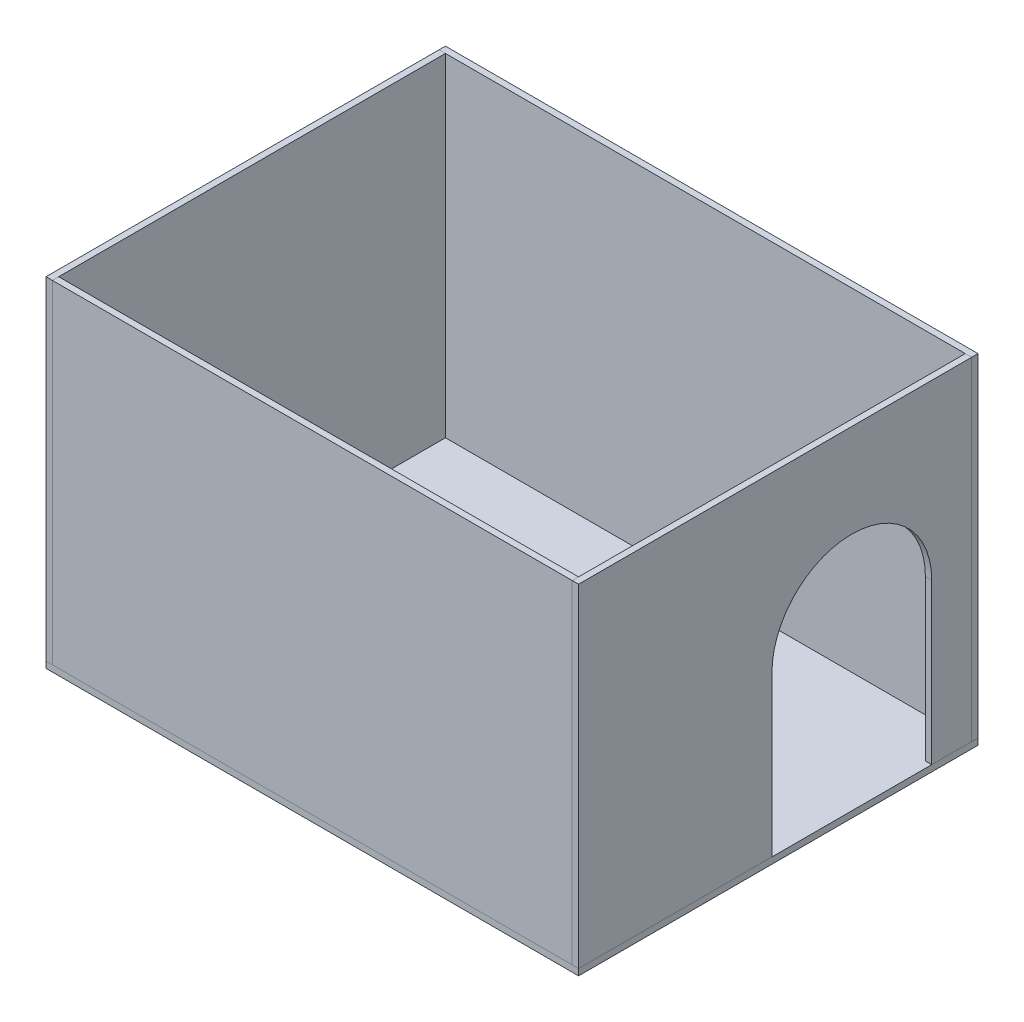
ISO-10303-21;
HEADER;
FILE_DESCRIPTION(('STEP AP214'),'2;1');
FILE_NAME('part.step','',(''),(''),'','','');
FILE_SCHEMA(('AUTOMOTIVE_DESIGN { 1 0 10303 214 1 1 1 1 }'));
ENDSEC;
DATA;
#1=APPLICATION_CONTEXT('core data for automotive mechanical design processes');
#2=APPLICATION_PROTOCOL_DEFINITION('international standard','automotive_design',2000,#1);
#3=PRODUCT_CONTEXT('',#1,'mechanical');
#4=PRODUCT('Part','Part','',(#3));
#5=PRODUCT_RELATED_PRODUCT_CATEGORY('part','',(#4));
#6=PRODUCT_DEFINITION_FORMATION('','',#4);
#7=PRODUCT_DEFINITION_CONTEXT('part definition',#1,'design');
#8=PRODUCT_DEFINITION('design','',#6,#7);
#9=PRODUCT_DEFINITION_SHAPE('','',#8);
#10=(LENGTH_UNIT() NAMED_UNIT(*) SI_UNIT(.MILLI.,.METRE.));
#11=(NAMED_UNIT(*) PLANE_ANGLE_UNIT() SI_UNIT($,.RADIAN.));
#12=(NAMED_UNIT(*) SI_UNIT($,.STERADIAN.) SOLID_ANGLE_UNIT());
#13=UNCERTAINTY_MEASURE_WITH_UNIT(LENGTH_MEASURE(1.E-05),#10,'distance_accuracy_value','');
#14=(GEOMETRIC_REPRESENTATION_CONTEXT(3) GLOBAL_UNCERTAINTY_ASSIGNED_CONTEXT((#13)) GLOBAL_UNIT_ASSIGNED_CONTEXT((#10,
#11,#12)) REPRESENTATION_CONTEXT('',''));
#15=CARTESIAN_POINT('',(0.,0.,0.));
#16=DIRECTION('',(0.,0.,1.));
#17=DIRECTION('',(1.,0.,0.));
#18=AXIS2_PLACEMENT_3D('',#15,#16,#17);
#19=CARTESIAN_POINT('',(0.,254.76,0.));
#20=DIRECTION('',(0.,0.,-1.));
#21=DIRECTION('',(-1.,0.,0.));
#22=AXIS2_PLACEMENT_3D('',#19,#20,#21);
#23=PLANE('',#22);
#24=DIRECTION('',(1.,0.,0.));
#25=VECTOR('',#24,1.);
#26=CARTESIAN_POINT('',(0.,4.76,0.));
#27=LINE('',#26,#25);
#28=CARTESIAN_POINT('',(4.76000000000004,4.76,0.));
#29=VERTEX_POINT('',#28);
#30=CARTESIAN_POINT('',(395.24,4.76,0.));
#31=VERTEX_POINT('',#30);
#32=EDGE_CURVE('E108',#29,#31,#27,.T.);
#33=ORIENTED_EDGE('',*,*,#32,.T.);
#34=DIRECTION('',(0.,-1.,0.));
#35=VECTOR('',#34,1.);
#36=CARTESIAN_POINT('',(395.24,254.76,0.));
#37=LINE('',#36,#35);
#38=CARTESIAN_POINT('',(395.24,254.76,0.));
#39=VERTEX_POINT('',#38);
#40=EDGE_CURVE('E12',#39,#31,#37,.T.);
#41=ORIENTED_EDGE('',*,*,#40,.F.);
#42=DIRECTION('',(1.,0.,0.));
#43=VECTOR('',#42,1.);
#44=CARTESIAN_POINT('',(0.,254.76,0.));
#45=LINE('',#44,#43);
#46=CARTESIAN_POINT('',(4.76000000000004,254.76,0.));
#47=VERTEX_POINT('',#46);
#48=EDGE_CURVE('E85',#47,#39,#45,.T.);
#49=ORIENTED_EDGE('',*,*,#48,.F.);
#50=DIRECTION('',(0.,-1.,0.));
#51=VECTOR('',#50,1.);
#52=CARTESIAN_POINT('',(4.76000000000004,254.76,0.));
#53=LINE('',#52,#51);
#54=EDGE_CURVE('E61',#47,#29,#53,.T.);
#55=ORIENTED_EDGE('',*,*,#54,.T.);
#56=EDGE_LOOP('',(#33,#41,#49,#55));
#57=FACE_BOUND('',#56,.T.);
#58=ADVANCED_FACE('F45',(#57),#23,.F.);
#59=CARTESIAN_POINT('',(395.24,254.76,0.));
#60=DIRECTION('',(1.,0.,0.));
#61=DIRECTION('',(0.,0.,-1.));
#62=AXIS2_PLACEMENT_3D('',#59,#60,#61);
#63=PLANE('',#62);
#64=DIRECTION('',(0.,0.,1.));
#65=VECTOR('',#64,1.);
#66=CARTESIAN_POINT('',(395.24,4.76,0.));
#67=LINE('',#66,#65);
#68=CARTESIAN_POINT('',(395.24,4.76,-4.76));
#69=VERTEX_POINT('',#68);
#70=EDGE_CURVE('E94',#69,#31,#67,.T.);
#71=ORIENTED_EDGE('',*,*,#70,.F.);
#72=DIRECTION('',(0.,-1.,0.));
#73=VECTOR('',#72,1.);
#74=CARTESIAN_POINT('',(395.24,254.76,-4.76));
#75=LINE('',#74,#73);
#76=CARTESIAN_POINT('',(395.24,254.76,-4.76));
#77=VERTEX_POINT('',#76);
#78=EDGE_CURVE('E53',#77,#69,#75,.T.);
#79=ORIENTED_EDGE('',*,*,#78,.F.);
#80=DIRECTION('',(0.,0.,1.));
#81=VECTOR('',#80,1.);
#82=CARTESIAN_POINT('',(395.24,254.76,0.));
#83=LINE('',#82,#81);
#84=EDGE_CURVE('E92',#77,#39,#83,.T.);
#85=ORIENTED_EDGE('',*,*,#84,.T.);
#86=ORIENTED_EDGE('',*,*,#40,.T.);
#87=EDGE_LOOP('',(#71,#79,#85,#86));
#88=FACE_BOUND('',#87,.T.);
#89=ADVANCED_FACE('F91',(#88),#63,.T.);
#90=CARTESIAN_POINT('',(0.,254.76,-4.76));
#91=DIRECTION('',(0.,0.,-1.));
#92=DIRECTION('',(-1.,0.,0.));
#93=AXIS2_PLACEMENT_3D('',#90,#91,#92);
#94=PLANE('',#93);
#95=DIRECTION('',(1.,0.,0.));
#96=VECTOR('',#95,1.);
#97=CARTESIAN_POINT('',(0.,4.76,-4.76));
#98=LINE('',#97,#96);
#99=CARTESIAN_POINT('',(4.76000000000004,4.76,-4.76));
#100=VERTEX_POINT('',#99);
#101=EDGE_CURVE('E111',#100,#69,#98,.T.);
#102=ORIENTED_EDGE('',*,*,#101,.F.);
#103=DIRECTION('',(0.,-1.,0.));
#104=VECTOR('',#103,1.);
#105=CARTESIAN_POINT('',(4.76000000000004,254.76,-4.76));
#106=LINE('',#105,#104);
#107=CARTESIAN_POINT('',(4.76000000000004,254.76,-4.76));
#108=VERTEX_POINT('',#107);
#109=EDGE_CURVE('E74',#108,#100,#106,.T.);
#110=ORIENTED_EDGE('',*,*,#109,.F.);
#111=DIRECTION('',(1.,0.,0.));
#112=VECTOR('',#111,1.);
#113=CARTESIAN_POINT('',(0.,254.76,-4.76));
#114=LINE('',#113,#112);
#115=EDGE_CURVE('E100',#108,#77,#114,.T.);
#116=ORIENTED_EDGE('',*,*,#115,.T.);
#117=ORIENTED_EDGE('',*,*,#78,.T.);
#118=EDGE_LOOP('',(#102,#110,#116,#117));
#119=FACE_BOUND('',#118,.T.);
#120=ADVANCED_FACE('F102',(#119),#94,.T.);
#121=CARTESIAN_POINT('',(4.76000000000004,254.76,0.));
#122=DIRECTION('',(-1.,0.,0.));
#123=DIRECTION('',(0.,0.,1.));
#124=AXIS2_PLACEMENT_3D('',#121,#122,#123);
#125=PLANE('',#124);
#126=DIRECTION('',(0.,0.,-1.));
#127=VECTOR('',#126,1.);
#128=CARTESIAN_POINT('',(4.76000000000004,4.76,0.));
#129=LINE('',#128,#127);
#130=EDGE_CURVE('E113',#29,#100,#129,.T.);
#131=ORIENTED_EDGE('',*,*,#130,.F.);
#132=ORIENTED_EDGE('',*,*,#54,.F.);
#133=DIRECTION('',(0.,0.,-1.));
#134=VECTOR('',#133,1.);
#135=CARTESIAN_POINT('',(4.76000000000004,254.76,0.));
#136=LINE('',#135,#134);
#137=EDGE_CURVE('E103',#47,#108,#136,.T.);
#138=ORIENTED_EDGE('',*,*,#137,.T.);
#139=ORIENTED_EDGE('',*,*,#109,.T.);
#140=EDGE_LOOP('',(#131,#132,#138,#139));
#141=FACE_BOUND('',#140,.T.);
#142=ADVANCED_FACE('F119',(#141),#125,.T.);
#143=CARTESIAN_POINT('',(0.,254.76,0.));
#144=DIRECTION('',(0.,-1.,0.));
#145=DIRECTION('',(0.,0.,-1.));
#146=AXIS2_PLACEMENT_3D('',#143,#144,#145);
#147=PLANE('',#146);
#148=ORIENTED_EDGE('',*,*,#48,.T.);
#149=ORIENTED_EDGE('',*,*,#84,.F.);
#150=ORIENTED_EDGE('',*,*,#115,.F.);
#151=ORIENTED_EDGE('',*,*,#137,.F.);
#152=EDGE_LOOP('',(#148,#149,#150,#151));
#153=FACE_BOUND('',#152,.T.);
#154=ADVANCED_FACE('F99',(#153),#147,.F.);
#155=CARTESIAN_POINT('',(0.,4.76,0.));
#156=DIRECTION('',(0.,-1.,0.));
#157=DIRECTION('',(0.,0.,-1.));
#158=AXIS2_PLACEMENT_3D('',#155,#156,#157);
#159=PLANE('',#158);
#160=ORIENTED_EDGE('',*,*,#32,.F.);
#161=ORIENTED_EDGE('',*,*,#130,.T.);
#162=ORIENTED_EDGE('',*,*,#101,.T.);
#163=ORIENTED_EDGE('',*,*,#70,.T.);
#164=EDGE_LOOP('',(#160,#161,#162,#163));
#165=FACE_BOUND('',#164,.T.);
#166=ADVANCED_FACE('F118',(#165),#159,.T.);
#167=CLOSED_SHELL('',(#58,#89,#120,#142,#154,#166));
#168=MANIFOLD_SOLID_BREP('B2',#167);
#169=CARTESIAN_POINT('',(0.,4.76,0.));
#170=DIRECTION('',(0.,1.,0.));
#171=DIRECTION('',(0.,0.,1.));
#172=AXIS2_PLACEMENT_3D('',#169,#170,#171);
#173=PLANE('',#172);
#174=DIRECTION('',(0.,0.,-1.));
#175=VECTOR('',#174,1.);
#176=CARTESIAN_POINT('',(395.24,4.76,0.));
#177=LINE('',#176,#175);
#178=CARTESIAN_POINT('',(395.24,4.76,0.));
#179=VERTEX_POINT('',#178);
#180=CARTESIAN_POINT('',(395.24,4.76,-145.24));
#181=VERTEX_POINT('',#180);
#182=EDGE_CURVE('E277',#179,#181,#177,.T.);
#183=ORIENTED_EDGE('',*,*,#182,.T.);
#184=DIRECTION('',(1.,0.,0.));
#185=VECTOR('',#184,1.);
#186=CARTESIAN_POINT('',(0.,4.76,-145.24));
#187=LINE('',#186,#185);
#188=CARTESIAN_POINT('',(400.,4.76,-145.24));
#189=VERTEX_POINT('',#188);
#190=EDGE_CURVE('E43',#181,#189,#187,.T.);
#191=ORIENTED_EDGE('',*,*,#190,.T.);
#192=DIRECTION('',(0.,0.,-1.));
#193=VECTOR('',#192,1.);
#194=CARTESIAN_POINT('',(400.,4.76,0.));
#195=LINE('',#194,#193);
#196=CARTESIAN_POINT('',(400.,4.76,0.));
#197=VERTEX_POINT('',#196);
#198=EDGE_CURVE('E269',#197,#189,#195,.T.);
#199=ORIENTED_EDGE('',*,*,#198,.F.);
#200=DIRECTION('',(1.,0.,0.));
#201=VECTOR('',#200,1.);
#202=CARTESIAN_POINT('',(0.,4.76,0.));
#203=LINE('',#202,#201);
#204=EDGE_CURVE('E271',#179,#197,#203,.T.);
#205=ORIENTED_EDGE('',*,*,#204,.F.);
#206=EDGE_LOOP('',(#183,#191,#199,#205));
#207=FACE_BOUND('',#206,.T.);
#208=ADVANCED_FACE('F179',(#207),#173,.F.);
#209=CARTESIAN_POINT('',(0.,254.76,-295.24));
#210=DIRECTION('',(0.,0.,-1.));
#211=DIRECTION('',(-1.,0.,0.));
#212=AXIS2_PLACEMENT_3D('',#209,#210,#211);
#213=PLANE('',#212);
#214=DIRECTION('',(1.,0.,0.));
#215=VECTOR('',#214,1.);
#216=CARTESIAN_POINT('',(0.,4.76,-295.24));
#217=LINE('',#216,#215);
#218=CARTESIAN_POINT('',(395.24,4.76,-295.24));
#219=VERTEX_POINT('',#218);
#220=CARTESIAN_POINT('',(400.,4.76,-295.24));
#221=VERTEX_POINT('',#220);
#222=EDGE_CURVE('E268',#219,#221,#217,.T.);
#223=ORIENTED_EDGE('',*,*,#222,.F.);
#224=DIRECTION('',(0.,-1.,0.));
#225=VECTOR('',#224,1.);
#226=CARTESIAN_POINT('',(395.24,254.76,-295.24));
#227=LINE('',#226,#225);
#228=CARTESIAN_POINT('',(395.24,254.76,-295.24));
#229=VERTEX_POINT('',#228);
#230=EDGE_CURVE('E203',#229,#219,#227,.T.);
#231=ORIENTED_EDGE('',*,*,#230,.F.);
#232=DIRECTION('',(1.,0.,0.));
#233=VECTOR('',#232,1.);
#234=CARTESIAN_POINT('',(0.,254.76,-295.24));
#235=LINE('',#234,#233);
#236=CARTESIAN_POINT('',(400.,254.76,-295.24));
#237=VERTEX_POINT('',#236);
#238=EDGE_CURVE('E280',#229,#237,#235,.T.);
#239=ORIENTED_EDGE('',*,*,#238,.T.);
#240=DIRECTION('',(0.,-1.,0.));
#241=VECTOR('',#240,1.);
#242=CARTESIAN_POINT('',(400.,254.76,-295.24));
#243=LINE('',#242,#241);
#244=EDGE_CURVE('E287',#237,#221,#243,.T.);
#245=ORIENTED_EDGE('',*,*,#244,.T.);
#246=EDGE_LOOP('',(#223,#231,#239,#245));
#247=FACE_BOUND('',#246,.T.);
#248=ADVANCED_FACE('F181',(#247),#213,.T.);
#249=CARTESIAN_POINT('',(395.24,254.76,0.));
#250=DIRECTION('',(-1.,0.,0.));
#251=DIRECTION('',(0.,0.,1.));
#252=AXIS2_PLACEMENT_3D('',#249,#250,#251);
#253=PLANE('',#252);
#254=DIRECTION('',(0.,1.,0.));
#255=VECTOR('',#254,1.);
#256=CARTESIAN_POINT('',(395.24,254.76,-145.24));
#257=LINE('',#256,#255);
#258=CARTESIAN_POINT('',(395.24,124.76,-145.24));
#259=VERTEX_POINT('',#258);
#260=EDGE_CURVE('E298',#181,#259,#257,.T.);
#261=ORIENTED_EDGE('',*,*,#260,.F.);
#262=ORIENTED_EDGE('',*,*,#182,.F.);
#263=DIRECTION('',(0.,-1.,0.));
#264=VECTOR('',#263,1.);
#265=CARTESIAN_POINT('',(395.24,254.76,0.));
#266=LINE('',#265,#264);
#267=CARTESIAN_POINT('',(395.24,254.76,0.));
#268=VERTEX_POINT('',#267);
#269=EDGE_CURVE('E282',#268,#179,#266,.T.);
#270=ORIENTED_EDGE('',*,*,#269,.F.);
#271=DIRECTION('',(0.,0.,-1.));
#272=VECTOR('',#271,1.);
#273=CARTESIAN_POINT('',(395.24,254.76,0.));
#274=LINE('',#273,#272);
#275=EDGE_CURVE('E288',#268,#229,#274,.T.);
#276=ORIENTED_EDGE('',*,*,#275,.T.);
#277=ORIENTED_EDGE('',*,*,#230,.T.);
#278=CARTESIAN_POINT('',(395.24,4.76,-265.24));
#279=VERTEX_POINT('',#278);
#280=EDGE_CURVE('E225',#279,#219,#177,.T.);
#281=ORIENTED_EDGE('',*,*,#280,.F.);
#282=DIRECTION('',(0.,-1.,0.));
#283=VECTOR('',#282,1.);
#284=CARTESIAN_POINT('',(395.24,254.76,-265.24));
#285=LINE('',#284,#283);
#286=CARTESIAN_POINT('',(395.24,124.76,-265.24));
#287=VERTEX_POINT('',#286);
#288=EDGE_CURVE('E194',#287,#279,#285,.T.);
#289=ORIENTED_EDGE('',*,*,#288,.F.);
#290=CARTESIAN_POINT('',(395.24,124.76,-205.24));
#291=DIRECTION('',(-1.,0.,0.));
#292=DIRECTION('',(0.,0.,1.));
#293=AXIS2_PLACEMENT_3D('',#290,#291,#292);
#294=CIRCLE('',#293,60.);
#295=EDGE_CURVE('E272',#259,#287,#294,.T.);
#296=ORIENTED_EDGE('',*,*,#295,.F.);
#297=EDGE_LOOP('',(#261,#262,#270,#276,#277,#281,#289,#296));
#298=FACE_BOUND('',#297,.T.);
#299=ADVANCED_FACE('F318',(#298),#253,.T.);
#300=CARTESIAN_POINT('',(0.,254.76,0.));
#301=DIRECTION('',(0.,0.,-1.));
#302=DIRECTION('',(-1.,0.,0.));
#303=AXIS2_PLACEMENT_3D('',#300,#301,#302);
#304=PLANE('',#303);
#305=ORIENTED_EDGE('',*,*,#204,.T.);
#306=DIRECTION('',(0.,-1.,0.));
#307=VECTOR('',#306,1.);
#308=CARTESIAN_POINT('',(400.,254.76,0.));
#309=LINE('',#308,#307);
#310=CARTESIAN_POINT('',(400.,254.76,0.));
#311=VERTEX_POINT('',#310);
#312=EDGE_CURVE('E284',#311,#197,#309,.T.);
#313=ORIENTED_EDGE('',*,*,#312,.F.);
#314=DIRECTION('',(1.,0.,0.));
#315=VECTOR('',#314,1.);
#316=CARTESIAN_POINT('',(0.,254.76,0.));
#317=LINE('',#316,#315);
#318=EDGE_CURVE('E290',#268,#311,#317,.T.);
#319=ORIENTED_EDGE('',*,*,#318,.F.);
#320=ORIENTED_EDGE('',*,*,#269,.T.);
#321=EDGE_LOOP('',(#305,#313,#319,#320));
#322=FACE_BOUND('',#321,.T.);
#323=ADVANCED_FACE('F325',(#322),#304,.F.);
#324=CARTESIAN_POINT('',(400.,254.76,0.));
#325=DIRECTION('',(-1.,0.,0.));
#326=DIRECTION('',(0.,0.,1.));
#327=AXIS2_PLACEMENT_3D('',#324,#325,#326);
#328=PLANE('',#327);
#329=ORIENTED_EDGE('',*,*,#198,.T.);
#330=DIRECTION('',(0.,-1.,0.));
#331=VECTOR('',#330,1.);
#332=CARTESIAN_POINT('',(400.,4.76,-145.24));
#333=LINE('',#332,#331);
#334=CARTESIAN_POINT('',(400.,124.76,-145.24));
#335=VERTEX_POINT('',#334);
#336=EDGE_CURVE('E304',#335,#189,#333,.T.);
#337=ORIENTED_EDGE('',*,*,#336,.F.);
#338=CARTESIAN_POINT('',(400.,124.76,-205.24));
#339=DIRECTION('',(1.,0.,0.));
#340=DIRECTION('',(0.,0.,1.));
#341=AXIS2_PLACEMENT_3D('',#338,#339,#340);
#342=CIRCLE('',#341,60.);
#343=CARTESIAN_POINT('',(400.,124.76,-265.24));
#344=VERTEX_POINT('',#343);
#345=EDGE_CURVE('E265',#344,#335,#342,.T.);
#346=ORIENTED_EDGE('',*,*,#345,.F.);
#347=DIRECTION('',(0.,1.,0.));
#348=VECTOR('',#347,1.);
#349=CARTESIAN_POINT('',(400.,124.76,-265.24));
#350=LINE('',#349,#348);
#351=CARTESIAN_POINT('',(400.,4.76,-265.24));
#352=VERTEX_POINT('',#351);
#353=EDGE_CURVE('E255',#352,#344,#350,.T.);
#354=ORIENTED_EDGE('',*,*,#353,.F.);
#355=EDGE_CURVE('E261',#352,#221,#195,.T.);
#356=ORIENTED_EDGE('',*,*,#355,.T.);
#357=ORIENTED_EDGE('',*,*,#244,.F.);
#358=DIRECTION('',(0.,0.,-1.));
#359=VECTOR('',#358,1.);
#360=CARTESIAN_POINT('',(400.,254.76,0.));
#361=LINE('',#360,#359);
#362=EDGE_CURVE('E231',#311,#237,#361,.T.);
#363=ORIENTED_EDGE('',*,*,#362,.F.);
#364=ORIENTED_EDGE('',*,*,#312,.T.);
#365=EDGE_LOOP('',(#329,#337,#346,#354,#356,#357,#363,#364));
#366=FACE_BOUND('',#365,.T.);
#367=ADVANCED_FACE('F260',(#366),#328,.F.);
#368=CARTESIAN_POINT('',(0.,254.76,0.));
#369=DIRECTION('',(0.,1.,0.));
#370=DIRECTION('',(0.,0.,1.));
#371=AXIS2_PLACEMENT_3D('',#368,#369,#370);
#372=PLANE('',#371);
#373=ORIENTED_EDGE('',*,*,#238,.F.);
#374=ORIENTED_EDGE('',*,*,#275,.F.);
#375=ORIENTED_EDGE('',*,*,#318,.T.);
#376=ORIENTED_EDGE('',*,*,#362,.T.);
#377=EDGE_LOOP('',(#373,#374,#375,#376));
#378=FACE_BOUND('',#377,.T.);
#379=ADVANCED_FACE('F334',(#378),#372,.T.);
#380=ORIENTED_EDGE('',*,*,#355,.F.);
#381=DIRECTION('',(-1.,0.,0.));
#382=VECTOR('',#381,1.);
#383=CARTESIAN_POINT('',(0.,4.76,-265.24));
#384=LINE('',#383,#382);
#385=EDGE_CURVE('E187',#352,#279,#384,.T.);
#386=ORIENTED_EDGE('',*,*,#385,.T.);
#387=ORIENTED_EDGE('',*,*,#280,.T.);
#388=ORIENTED_EDGE('',*,*,#222,.T.);
#389=EDGE_LOOP('',(#380,#386,#387,#388));
#390=FACE_BOUND('',#389,.T.);
#391=ADVANCED_FACE('F267',(#390),#173,.F.);
#392=CARTESIAN_POINT('',(395.,4.76,-145.24));
#393=DIRECTION('',(0.,0.,1.));
#394=DIRECTION('',(0.,-1.,0.));
#395=AXIS2_PLACEMENT_3D('',#392,#393,#394);
#396=PLANE('',#395);
#397=ORIENTED_EDGE('',*,*,#260,.T.);
#398=DIRECTION('',(1.,0.,0.));
#399=VECTOR('',#398,1.);
#400=CARTESIAN_POINT('',(395.,124.76,-145.24));
#401=LINE('',#400,#399);
#402=EDGE_CURVE('E301',#259,#335,#401,.T.);
#403=ORIENTED_EDGE('',*,*,#402,.T.);
#404=ORIENTED_EDGE('',*,*,#336,.T.);
#405=ORIENTED_EDGE('',*,*,#190,.F.);
#406=EDGE_LOOP('',(#397,#403,#404,#405));
#407=FACE_BOUND('',#406,.T.);
#408=ADVANCED_FACE('F313',(#407),#396,.F.);
#409=CARTESIAN_POINT('',(395.,124.76,-205.24));
#410=DIRECTION('',(1.,0.,0.));
#411=DIRECTION('',(0.,0.,-1.));
#412=AXIS2_PLACEMENT_3D('',#409,#410,#411);
#413=CYLINDRICAL_SURFACE('',#412,60.);
#414=ORIENTED_EDGE('',*,*,#295,.T.);
#415=DIRECTION('',(1.,0.,0.));
#416=VECTOR('',#415,1.);
#417=CARTESIAN_POINT('',(395.,124.76,-265.24));
#418=LINE('',#417,#416);
#419=EDGE_CURVE('E302',#287,#344,#418,.T.);
#420=ORIENTED_EDGE('',*,*,#419,.T.);
#421=ORIENTED_EDGE('',*,*,#345,.T.);
#422=ORIENTED_EDGE('',*,*,#402,.F.);
#423=EDGE_LOOP('',(#414,#420,#421,#422));
#424=FACE_BOUND('',#423,.T.);
#425=ADVANCED_FACE('F309',(#424),#413,.F.);
#426=CARTESIAN_POINT('',(395.,124.76,-265.24));
#427=DIRECTION('',(0.,0.,-1.));
#428=DIRECTION('',(-1.,0.,0.));
#429=AXIS2_PLACEMENT_3D('',#426,#427,#428);
#430=PLANE('',#429);
#431=ORIENTED_EDGE('',*,*,#288,.T.);
#432=ORIENTED_EDGE('',*,*,#385,.F.);
#433=ORIENTED_EDGE('',*,*,#353,.T.);
#434=ORIENTED_EDGE('',*,*,#419,.F.);
#435=EDGE_LOOP('',(#431,#432,#433,#434));
#436=FACE_BOUND('',#435,.T.);
#437=ADVANCED_FACE('F254',(#436),#430,.F.);
#438=CLOSED_SHELL('',(#208,#248,#299,#323,#367,#379,#391,#408,#425,#437));
#439=MANIFOLD_SOLID_BREP('B6',#438);
#440=CARTESIAN_POINT('',(2.29595754173402E-12,254.76,0.));
#441=DIRECTION('',(1.,0.,0.));
#442=DIRECTION('',(0.,0.,-1.));
#443=AXIS2_PLACEMENT_3D('',#440,#441,#442);
#444=PLANE('',#443);
#445=DIRECTION('',(0.,0.,1.));
#446=VECTOR('',#445,1.);
#447=CARTESIAN_POINT('',(2.29595754173402E-12,4.76,0.));
#448=LINE('',#447,#446);
#449=CARTESIAN_POINT('',(0.,4.76,-300.));
#450=VERTEX_POINT('',#449);
#451=CARTESIAN_POINT('',(0.,4.76,-295.24));
#452=VERTEX_POINT('',#451);
#453=EDGE_CURVE('E476',#450,#452,#448,.T.);
#454=ORIENTED_EDGE('',*,*,#453,.T.);
#455=DIRECTION('',(0.,-1.,0.));
#456=VECTOR('',#455,1.);
#457=CARTESIAN_POINT('',(0.,254.76,-295.24));
#458=LINE('',#457,#456);
#459=CARTESIAN_POINT('',(0.,254.76,-295.24));
#460=VERTEX_POINT('',#459);
#461=EDGE_CURVE('E177',#460,#452,#458,.T.);
#462=ORIENTED_EDGE('',*,*,#461,.F.);
#463=DIRECTION('',(0.,0.,1.));
#464=VECTOR('',#463,1.);
#465=CARTESIAN_POINT('',(2.29595754173402E-12,254.76,0.));
#466=LINE('',#465,#464);
#467=CARTESIAN_POINT('',(0.,254.76,-300.));
#468=VERTEX_POINT('',#467);
#469=EDGE_CURVE('E462',#468,#460,#466,.T.);
#470=ORIENTED_EDGE('',*,*,#469,.F.);
#471=DIRECTION('',(0.,-1.,0.));
#472=VECTOR('',#471,1.);
#473=CARTESIAN_POINT('',(0.,254.76,-300.));
#474=LINE('',#473,#472);
#475=EDGE_CURVE('E429',#468,#450,#474,.T.);
#476=ORIENTED_EDGE('',*,*,#475,.T.);
#477=EDGE_LOOP('',(#454,#462,#470,#476));
#478=FACE_BOUND('',#477,.T.);
#479=ADVANCED_FACE('F413',(#478),#444,.F.);
#480=CARTESIAN_POINT('',(0.,254.76,-295.24));
#481=DIRECTION('',(0.,0.,-1.));
#482=DIRECTION('',(-1.,0.,0.));
#483=AXIS2_PLACEMENT_3D('',#480,#481,#482);
#484=PLANE('',#483);
#485=DIRECTION('',(1.,0.,0.));
#486=VECTOR('',#485,1.);
#487=CARTESIAN_POINT('',(0.,4.76,-295.24));
#488=LINE('',#487,#486);
#489=CARTESIAN_POINT('',(400.,4.76,-295.24));
#490=VERTEX_POINT('',#489);
#491=EDGE_CURVE('E467',#452,#490,#488,.T.);
#492=ORIENTED_EDGE('',*,*,#491,.T.);
#493=DIRECTION('',(0.,-1.,0.));
#494=VECTOR('',#493,1.);
#495=CARTESIAN_POINT('',(400.,254.76,-295.24));
#496=LINE('',#495,#494);
#497=CARTESIAN_POINT('',(400.,254.76,-295.24));
#498=VERTEX_POINT('',#497);
#499=EDGE_CURVE('E421',#498,#490,#496,.T.);
#500=ORIENTED_EDGE('',*,*,#499,.F.);
#501=DIRECTION('',(1.,0.,0.));
#502=VECTOR('',#501,1.);
#503=CARTESIAN_POINT('',(0.,254.76,-295.24));
#504=LINE('',#503,#502);
#505=EDGE_CURVE('E454',#460,#498,#504,.T.);
#506=ORIENTED_EDGE('',*,*,#505,.F.);
#507=ORIENTED_EDGE('',*,*,#461,.T.);
#508=EDGE_LOOP('',(#492,#500,#506,#507));
#509=FACE_BOUND('',#508,.T.);
#510=ADVANCED_FACE('F466',(#509),#484,.F.);
#511=CARTESIAN_POINT('',(400.,254.76,0.));
#512=DIRECTION('',(1.,0.,0.));
#513=DIRECTION('',(0.,0.,-1.));
#514=AXIS2_PLACEMENT_3D('',#511,#512,#513);
#515=PLANE('',#514);
#516=DIRECTION('',(0.,0.,1.));
#517=VECTOR('',#516,1.);
#518=CARTESIAN_POINT('',(400.,4.76,0.));
#519=LINE('',#518,#517);
#520=CARTESIAN_POINT('',(400.,4.76,-300.));
#521=VERTEX_POINT('',#520);
#522=EDGE_CURVE('E479',#521,#490,#519,.T.);
#523=ORIENTED_EDGE('',*,*,#522,.F.);
#524=DIRECTION('',(0.,-1.,0.));
#525=VECTOR('',#524,1.);
#526=CARTESIAN_POINT('',(400.,254.76,-300.));
#527=LINE('',#526,#525);
#528=CARTESIAN_POINT('',(400.,254.76,-300.));
#529=VERTEX_POINT('',#528);
#530=EDGE_CURVE('E443',#529,#521,#527,.T.);
#531=ORIENTED_EDGE('',*,*,#530,.F.);
#532=DIRECTION('',(0.,0.,1.));
#533=VECTOR('',#532,1.);
#534=CARTESIAN_POINT('',(400.,254.76,0.));
#535=LINE('',#534,#533);
#536=EDGE_CURVE('E461',#529,#498,#535,.T.);
#537=ORIENTED_EDGE('',*,*,#536,.T.);
#538=ORIENTED_EDGE('',*,*,#499,.T.);
#539=EDGE_LOOP('',(#523,#531,#537,#538));
#540=FACE_BOUND('',#539,.T.);
#541=ADVANCED_FACE('F470',(#540),#515,.T.);
#542=CARTESIAN_POINT('',(0.,254.76,-300.));
#543=DIRECTION('',(0.,0.,-1.));
#544=DIRECTION('',(-1.,0.,0.));
#545=AXIS2_PLACEMENT_3D('',#542,#543,#544);
#546=PLANE('',#545);
#547=DIRECTION('',(1.,0.,0.));
#548=VECTOR('',#547,1.);
#549=CARTESIAN_POINT('',(0.,4.76,-300.));
#550=LINE('',#549,#548);
#551=EDGE_CURVE('E481',#450,#521,#550,.T.);
#552=ORIENTED_EDGE('',*,*,#551,.F.);
#553=ORIENTED_EDGE('',*,*,#475,.F.);
#554=DIRECTION('',(1.,0.,0.));
#555=VECTOR('',#554,1.);
#556=CARTESIAN_POINT('',(0.,254.76,-300.));
#557=LINE('',#556,#555);
#558=EDGE_CURVE('E471',#468,#529,#557,.T.);
#559=ORIENTED_EDGE('',*,*,#558,.T.);
#560=ORIENTED_EDGE('',*,*,#530,.T.);
#561=EDGE_LOOP('',(#552,#553,#559,#560));
#562=FACE_BOUND('',#561,.T.);
#563=ADVANCED_FACE('F487',(#562),#546,.T.);
#564=CARTESIAN_POINT('',(0.,254.76,0.));
#565=DIRECTION('',(0.,1.,0.));
#566=DIRECTION('',(0.,0.,1.));
#567=AXIS2_PLACEMENT_3D('',#564,#565,#566);
#568=PLANE('',#567);
#569=ORIENTED_EDGE('',*,*,#469,.T.);
#570=ORIENTED_EDGE('',*,*,#505,.T.);
#571=ORIENTED_EDGE('',*,*,#536,.F.);
#572=ORIENTED_EDGE('',*,*,#558,.F.);
#573=EDGE_LOOP('',(#569,#570,#571,#572));
#574=FACE_BOUND('',#573,.T.);
#575=ADVANCED_FACE('F458',(#574),#568,.T.);
#576=CARTESIAN_POINT('',(0.,4.76,0.));
#577=DIRECTION('',(0.,1.,0.));
#578=DIRECTION('',(0.,0.,1.));
#579=AXIS2_PLACEMENT_3D('',#576,#577,#578);
#580=PLANE('',#579);
#581=ORIENTED_EDGE('',*,*,#453,.F.);
#582=ORIENTED_EDGE('',*,*,#551,.T.);
#583=ORIENTED_EDGE('',*,*,#522,.T.);
#584=ORIENTED_EDGE('',*,*,#491,.F.);
#585=EDGE_LOOP('',(#581,#582,#583,#584));
#586=FACE_BOUND('',#585,.T.);
#587=ADVANCED_FACE('F486',(#586),#580,.F.);
#588=CLOSED_SHELL('',(#479,#510,#541,#563,#575,#587));
#589=MANIFOLD_SOLID_BREP('B37',#588);
#590=CARTESIAN_POINT('',(4.76000000000004,254.76,0.));
#591=DIRECTION('',(-1.,0.,0.));
#592=DIRECTION('',(0.,0.,1.));
#593=AXIS2_PLACEMENT_3D('',#590,#591,#592);
#594=PLANE('',#593);
#595=DIRECTION('',(0.,0.,-1.));
#596=VECTOR('',#595,1.);
#597=CARTESIAN_POINT('',(4.76000000000004,4.76,0.));
#598=LINE('',#597,#596);
#599=CARTESIAN_POINT('',(4.76000000000004,4.76,0.));
#600=VERTEX_POINT('',#599);
#601=CARTESIAN_POINT('',(4.76000000000004,4.76,-295.24));
#602=VERTEX_POINT('',#601);
#603=EDGE_CURVE('E608',#600,#602,#598,.T.);
#604=ORIENTED_EDGE('',*,*,#603,.T.);
#605=DIRECTION('',(0.,-1.,0.));
#606=VECTOR('',#605,1.);
#607=CARTESIAN_POINT('',(4.76000000000004,254.76,-295.24));
#608=LINE('',#607,#606);
#609=CARTESIAN_POINT('',(4.76000000000004,254.76,-295.24));
#610=VERTEX_POINT('',#609);
#611=EDGE_CURVE('E411',#610,#602,#608,.T.);
#612=ORIENTED_EDGE('',*,*,#611,.F.);
#613=DIRECTION('',(0.,0.,-1.));
#614=VECTOR('',#613,1.);
#615=CARTESIAN_POINT('',(4.76000000000004,254.76,0.));
#616=LINE('',#615,#614);
#617=CARTESIAN_POINT('',(4.76000000000004,254.76,0.));
#618=VERTEX_POINT('',#617);
#619=EDGE_CURVE('E585',#618,#610,#616,.T.);
#620=ORIENTED_EDGE('',*,*,#619,.F.);
#621=DIRECTION('',(0.,-1.,0.));
#622=VECTOR('',#621,1.);
#623=CARTESIAN_POINT('',(4.76000000000004,254.76,0.));
#624=LINE('',#623,#622);
#625=EDGE_CURVE('E561',#618,#600,#624,.T.);
#626=ORIENTED_EDGE('',*,*,#625,.T.);
#627=EDGE_LOOP('',(#604,#612,#620,#626));
#628=FACE_BOUND('',#627,.T.);
#629=ADVANCED_FACE('F545',(#628),#594,.F.);
#630=CARTESIAN_POINT('',(0.,254.76,-295.24));
#631=DIRECTION('',(0.,0.,-1.));
#632=DIRECTION('',(-1.,0.,0.));
#633=AXIS2_PLACEMENT_3D('',#630,#631,#632);
#634=PLANE('',#633);
#635=DIRECTION('',(1.,0.,0.));
#636=VECTOR('',#635,1.);
#637=CARTESIAN_POINT('',(0.,4.76,-295.24));
#638=LINE('',#637,#636);
#639=CARTESIAN_POINT('',(0.,4.76,-295.24));
#640=VERTEX_POINT('',#639);
#641=EDGE_CURVE('E594',#640,#602,#638,.T.);
#642=ORIENTED_EDGE('',*,*,#641,.F.);
#643=DIRECTION('',(0.,-1.,0.));
#644=VECTOR('',#643,1.);
#645=CARTESIAN_POINT('',(0.,254.76,-295.24));
#646=LINE('',#645,#644);
#647=CARTESIAN_POINT('',(0.,254.76,-295.24));
#648=VERTEX_POINT('',#647);
#649=EDGE_CURVE('E553',#648,#640,#646,.T.);
#650=ORIENTED_EDGE('',*,*,#649,.F.);
#651=DIRECTION('',(1.,0.,0.));
#652=VECTOR('',#651,1.);
#653=CARTESIAN_POINT('',(0.,254.76,-295.24));
#654=LINE('',#653,#652);
#655=EDGE_CURVE('E592',#648,#610,#654,.T.);
#656=ORIENTED_EDGE('',*,*,#655,.T.);
#657=ORIENTED_EDGE('',*,*,#611,.T.);
#658=EDGE_LOOP('',(#642,#650,#656,#657));
#659=FACE_BOUND('',#658,.T.);
#660=ADVANCED_FACE('F591',(#659),#634,.T.);
#661=CARTESIAN_POINT('',(0.,254.76,0.));
#662=DIRECTION('',(-1.,0.,0.));
#663=DIRECTION('',(0.,0.,1.));
#664=AXIS2_PLACEMENT_3D('',#661,#662,#663);
#665=PLANE('',#664);
#666=DIRECTION('',(0.,0.,-1.));
#667=VECTOR('',#666,1.);
#668=CARTESIAN_POINT('',(0.,4.76,0.));
#669=LINE('',#668,#667);
#670=CARTESIAN_POINT('',(0.,4.76,0.));
#671=VERTEX_POINT('',#670);
#672=EDGE_CURVE('E611',#671,#640,#669,.T.);
#673=ORIENTED_EDGE('',*,*,#672,.F.);
#674=DIRECTION('',(0.,-1.,0.));
#675=VECTOR('',#674,1.);
#676=CARTESIAN_POINT('',(0.,254.76,0.));
#677=LINE('',#676,#675);
#678=CARTESIAN_POINT('',(0.,254.76,0.));
#679=VERTEX_POINT('',#678);
#680=EDGE_CURVE('E574',#679,#671,#677,.T.);
#681=ORIENTED_EDGE('',*,*,#680,.F.);
#682=DIRECTION('',(0.,0.,-1.));
#683=VECTOR('',#682,1.);
#684=CARTESIAN_POINT('',(0.,254.76,0.));
#685=LINE('',#684,#683);
#686=EDGE_CURVE('E600',#679,#648,#685,.T.);
#687=ORIENTED_EDGE('',*,*,#686,.T.);
#688=ORIENTED_EDGE('',*,*,#649,.T.);
#689=EDGE_LOOP('',(#673,#681,#687,#688));
#690=FACE_BOUND('',#689,.T.);
#691=ADVANCED_FACE('F602',(#690),#665,.T.);
#692=CARTESIAN_POINT('',(0.,254.76,0.));
#693=DIRECTION('',(0.,0.,1.));
#694=DIRECTION('',(1.,0.,0.));
#695=AXIS2_PLACEMENT_3D('',#692,#693,#694);
#696=PLANE('',#695);
#697=DIRECTION('',(-1.,0.,0.));
#698=VECTOR('',#697,1.);
#699=CARTESIAN_POINT('',(0.,4.76,0.));
#700=LINE('',#699,#698);
#701=EDGE_CURVE('E613',#600,#671,#700,.T.);
#702=ORIENTED_EDGE('',*,*,#701,.F.);
#703=ORIENTED_EDGE('',*,*,#625,.F.);
#704=DIRECTION('',(-1.,0.,0.));
#705=VECTOR('',#704,1.);
#706=CARTESIAN_POINT('',(0.,254.76,0.));
#707=LINE('',#706,#705);
#708=EDGE_CURVE('E603',#618,#679,#707,.T.);
#709=ORIENTED_EDGE('',*,*,#708,.T.);
#710=ORIENTED_EDGE('',*,*,#680,.T.);
#711=EDGE_LOOP('',(#702,#703,#709,#710));
#712=FACE_BOUND('',#711,.T.);
#713=ADVANCED_FACE('F619',(#712),#696,.T.);
#714=CARTESIAN_POINT('',(0.,254.76,0.));
#715=DIRECTION('',(0.,-1.,0.));
#716=DIRECTION('',(0.,0.,-1.));
#717=AXIS2_PLACEMENT_3D('',#714,#715,#716);
#718=PLANE('',#717);
#719=ORIENTED_EDGE('',*,*,#619,.T.);
#720=ORIENTED_EDGE('',*,*,#655,.F.);
#721=ORIENTED_EDGE('',*,*,#686,.F.);
#722=ORIENTED_EDGE('',*,*,#708,.F.);
#723=EDGE_LOOP('',(#719,#720,#721,#722));
#724=FACE_BOUND('',#723,.T.);
#725=ADVANCED_FACE('F599',(#724),#718,.F.);
#726=CARTESIAN_POINT('',(0.,4.76,0.));
#727=DIRECTION('',(0.,-1.,0.));
#728=DIRECTION('',(0.,0.,-1.));
#729=AXIS2_PLACEMENT_3D('',#726,#727,#728);
#730=PLANE('',#729);
#731=ORIENTED_EDGE('',*,*,#603,.F.);
#732=ORIENTED_EDGE('',*,*,#701,.T.);
#733=ORIENTED_EDGE('',*,*,#672,.T.);
#734=ORIENTED_EDGE('',*,*,#641,.T.);
#735=EDGE_LOOP('',(#731,#732,#733,#734));
#736=FACE_BOUND('',#735,.T.);
#737=ADVANCED_FACE('F618',(#736),#730,.T.);
#738=CLOSED_SHELL('',(#629,#660,#691,#713,#725,#737));
#739=MANIFOLD_SOLID_BREP('B171',#738);
#740=CARTESIAN_POINT('',(0.,4.76,0.));
#741=DIRECTION('',(1.,0.,0.));
#742=DIRECTION('',(0.,0.,-1.));
#743=AXIS2_PLACEMENT_3D('',#740,#741,#742);
#744=PLANE('',#743);
#745=DIRECTION('',(0.,0.,1.));
#746=VECTOR('',#745,1.);
#747=CARTESIAN_POINT('',(0.,0.,0.));
#748=LINE('',#747,#746);
#749=CARTESIAN_POINT('',(0.,0.,-300.));
#750=VERTEX_POINT('',#749);
#751=CARTESIAN_POINT('',(0.,0.,0.));
#752=VERTEX_POINT('',#751);
#753=EDGE_CURVE('E733',#750,#752,#748,.T.);
#754=ORIENTED_EDGE('',*,*,#753,.T.);
#755=DIRECTION('',(0.,-1.,0.));
#756=VECTOR('',#755,1.);
#757=CARTESIAN_POINT('',(0.,4.76,0.));
#758=LINE('',#757,#756);
#759=CARTESIAN_POINT('',(0.,4.76,0.));
#760=VERTEX_POINT('',#759);
#761=EDGE_CURVE('E543',#760,#752,#758,.T.);
#762=ORIENTED_EDGE('',*,*,#761,.F.);
#763=DIRECTION('',(0.,0.,1.));
#764=VECTOR('',#763,1.);
#765=CARTESIAN_POINT('',(0.,4.76,0.));
#766=LINE('',#765,#764);
#767=CARTESIAN_POINT('',(0.,4.76,-300.));
#768=VERTEX_POINT('',#767);
#769=EDGE_CURVE('E720',#768,#760,#766,.T.);
#770=ORIENTED_EDGE('',*,*,#769,.F.);
#771=DIRECTION('',(0.,-1.,0.));
#772=VECTOR('',#771,1.);
#773=CARTESIAN_POINT('',(0.,4.76,-300.));
#774=LINE('',#773,#772);
#775=EDGE_CURVE('E728',#768,#750,#774,.T.);
#776=ORIENTED_EDGE('',*,*,#775,.T.);
#777=EDGE_LOOP('',(#754,#762,#770,#776));
#778=FACE_BOUND('',#777,.T.);
#779=ADVANCED_FACE('F668',(#778),#744,.F.);
#780=CARTESIAN_POINT('',(0.,4.76,0.));
#781=DIRECTION('',(0.,0.,-1.));
#782=DIRECTION('',(-1.,0.,0.));
#783=AXIS2_PLACEMENT_3D('',#780,#781,#782);
#784=PLANE('',#783);
#785=DIRECTION('',(1.,0.,0.));
#786=VECTOR('',#785,1.);
#787=CARTESIAN_POINT('',(0.,0.,0.));
#788=LINE('',#787,#786);
#789=CARTESIAN_POINT('',(400.,0.,0.));
#790=VERTEX_POINT('',#789);
#791=EDGE_CURVE('E724',#752,#790,#788,.T.);
#792=ORIENTED_EDGE('',*,*,#791,.T.);
#793=DIRECTION('',(0.,-1.,0.));
#794=VECTOR('',#793,1.);
#795=CARTESIAN_POINT('',(400.,4.76,0.));
#796=LINE('',#795,#794);
#797=CARTESIAN_POINT('',(400.,4.76,0.));
#798=VERTEX_POINT('',#797);
#799=EDGE_CURVE('E678',#798,#790,#796,.T.);
#800=ORIENTED_EDGE('',*,*,#799,.F.);
#801=DIRECTION('',(1.,0.,0.));
#802=VECTOR('',#801,1.);
#803=CARTESIAN_POINT('',(0.,4.76,0.));
#804=LINE('',#803,#802);
#805=EDGE_CURVE('E716',#760,#798,#804,.T.);
#806=ORIENTED_EDGE('',*,*,#805,.F.);
#807=ORIENTED_EDGE('',*,*,#761,.T.);
#808=EDGE_LOOP('',(#792,#800,#806,#807));
#809=FACE_BOUND('',#808,.T.);
#810=ADVANCED_FACE('F723',(#809),#784,.F.);
#811=CARTESIAN_POINT('',(400.,4.76,0.));
#812=DIRECTION('',(-1.,0.,0.));
#813=DIRECTION('',(0.,0.,1.));
#814=AXIS2_PLACEMENT_3D('',#811,#812,#813);
#815=PLANE('',#814);
#816=DIRECTION('',(0.,0.,-1.));
#817=VECTOR('',#816,1.);
#818=CARTESIAN_POINT('',(400.,0.,0.));
#819=LINE('',#818,#817);
#820=CARTESIAN_POINT('',(400.,0.,-300.));
#821=VERTEX_POINT('',#820);
#822=EDGE_CURVE('E703',#790,#821,#819,.T.);
#823=ORIENTED_EDGE('',*,*,#822,.T.);
#824=DIRECTION('',(0.,-1.,0.));
#825=VECTOR('',#824,1.);
#826=CARTESIAN_POINT('',(400.,4.76,-300.));
#827=LINE('',#826,#825);
#828=CARTESIAN_POINT('',(400.,4.76,-300.));
#829=VERTEX_POINT('',#828);
#830=EDGE_CURVE('E725',#829,#821,#827,.T.);
#831=ORIENTED_EDGE('',*,*,#830,.F.);
#832=DIRECTION('',(0.,0.,-1.));
#833=VECTOR('',#832,1.);
#834=CARTESIAN_POINT('',(400.,4.76,0.));
#835=LINE('',#834,#833);
#836=EDGE_CURVE('E671',#798,#829,#835,.T.);
#837=ORIENTED_EDGE('',*,*,#836,.F.);
#838=ORIENTED_EDGE('',*,*,#799,.T.);
#839=EDGE_LOOP('',(#823,#831,#837,#838));
#840=FACE_BOUND('',#839,.T.);
#841=ADVANCED_FACE('F727',(#840),#815,.F.);
#842=CARTESIAN_POINT('',(0.,4.76,-300.));
#843=DIRECTION('',(0.,0.,1.));
#844=DIRECTION('',(1.,0.,0.));
#845=AXIS2_PLACEMENT_3D('',#842,#843,#844);
#846=PLANE('',#845);
#847=DIRECTION('',(-1.,0.,0.));
#848=VECTOR('',#847,1.);
#849=CARTESIAN_POINT('',(0.,0.,-300.));
#850=LINE('',#849,#848);
#851=EDGE_CURVE('E709',#821,#750,#850,.T.);
#852=ORIENTED_EDGE('',*,*,#851,.T.);
#853=ORIENTED_EDGE('',*,*,#775,.F.);
#854=DIRECTION('',(-1.,0.,0.));
#855=VECTOR('',#854,1.);
#856=CARTESIAN_POINT('',(0.,4.76,-300.));
#857=LINE('',#856,#855);
#858=EDGE_CURVE('E686',#829,#768,#857,.T.);
#859=ORIENTED_EDGE('',*,*,#858,.F.);
#860=ORIENTED_EDGE('',*,*,#830,.T.);
#861=EDGE_LOOP('',(#852,#853,#859,#860));
#862=FACE_BOUND('',#861,.T.);
#863=ADVANCED_FACE('F739',(#862),#846,.F.);
#864=CARTESIAN_POINT('',(0.,4.76,0.));
#865=DIRECTION('',(0.,-1.,0.));
#866=DIRECTION('',(0.,0.,-1.));
#867=AXIS2_PLACEMENT_3D('',#864,#865,#866);
#868=PLANE('',#867);
#869=ORIENTED_EDGE('',*,*,#836,.T.);
#870=ORIENTED_EDGE('',*,*,#858,.T.);
#871=ORIENTED_EDGE('',*,*,#769,.T.);
#872=ORIENTED_EDGE('',*,*,#805,.T.);
#873=EDGE_LOOP('',(#869,#870,#871,#872));
#874=FACE_BOUND('',#873,.T.);
#875=ADVANCED_FACE('F717',(#874),#868,.F.);
#876=CARTESIAN_POINT('',(0.,0.,0.));
#877=DIRECTION('',(0.,-1.,0.));
#878=DIRECTION('',(0.,0.,-1.));
#879=AXIS2_PLACEMENT_3D('',#876,#877,#878);
#880=PLANE('',#879);
#881=ORIENTED_EDGE('',*,*,#753,.F.);
#882=ORIENTED_EDGE('',*,*,#851,.F.);
#883=ORIENTED_EDGE('',*,*,#822,.F.);
#884=ORIENTED_EDGE('',*,*,#791,.F.);
#885=EDGE_LOOP('',(#881,#882,#883,#884));
#886=FACE_BOUND('',#885,.T.);
#887=ADVANCED_FACE('F742',(#886),#880,.T.);
#888=CLOSED_SHELL('',(#779,#810,#841,#863,#875,#887));
#889=MANIFOLD_SOLID_BREP('B405',#888);
#890=ADVANCED_BREP_SHAPE_REPRESENTATION('',(#18,#168,#439,#589,#739,#889),#14);
#891=SHAPE_DEFINITION_REPRESENTATION(#9,#890);
ENDSEC;
END-ISO-10303-21;
